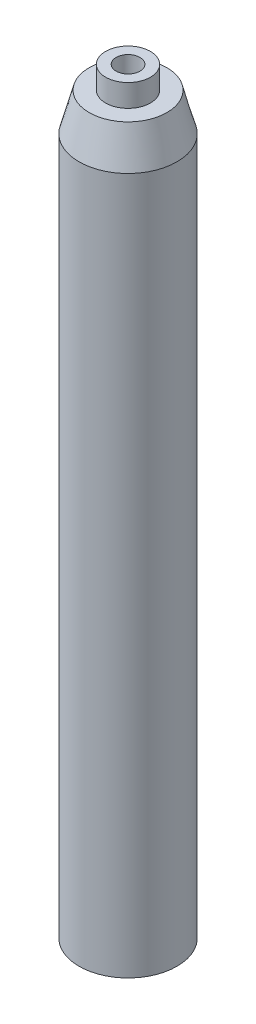
ISO-10303-21;
HEADER;
FILE_DESCRIPTION(('STEP AP214'),'2;1');
FILE_NAME('part.step','',(''),(''),'','','');
FILE_SCHEMA(('AUTOMOTIVE_DESIGN { 1 0 10303 214 1 1 1 1 }'));
ENDSEC;
DATA;
#1=APPLICATION_CONTEXT('core data for automotive mechanical design processes');
#2=APPLICATION_PROTOCOL_DEFINITION('international standard','automotive_design',2000,#1);
#3=PRODUCT_CONTEXT('',#1,'mechanical');
#4=PRODUCT('Part','Part','',(#3));
#5=PRODUCT_RELATED_PRODUCT_CATEGORY('part','',(#4));
#6=PRODUCT_DEFINITION_FORMATION('','',#4);
#7=PRODUCT_DEFINITION_CONTEXT('part definition',#1,'design');
#8=PRODUCT_DEFINITION('design','',#6,#7);
#9=PRODUCT_DEFINITION_SHAPE('','',#8);
#10=(LENGTH_UNIT() NAMED_UNIT(*) SI_UNIT(.MILLI.,.METRE.));
#11=(NAMED_UNIT(*) PLANE_ANGLE_UNIT() SI_UNIT($,.RADIAN.));
#12=(NAMED_UNIT(*) SI_UNIT($,.STERADIAN.) SOLID_ANGLE_UNIT());
#13=UNCERTAINTY_MEASURE_WITH_UNIT(LENGTH_MEASURE(1.E-05),#10,'distance_accuracy_value','');
#14=(GEOMETRIC_REPRESENTATION_CONTEXT(3) GLOBAL_UNCERTAINTY_ASSIGNED_CONTEXT((#13)) GLOBAL_UNIT_ASSIGNED_CONTEXT((#10,
#11,#12)) REPRESENTATION_CONTEXT('',''));
#15=CARTESIAN_POINT('',(0.,0.,0.));
#16=DIRECTION('',(0.,0.,1.));
#17=DIRECTION('',(1.,0.,0.));
#18=AXIS2_PLACEMENT_3D('',#15,#16,#17);
#19=CARTESIAN_POINT('',(0.,85.852,0.));
#20=DIRECTION('',(0.,-1.,0.));
#21=DIRECTION('',(1.,0.,0.));
#22=AXIS2_PLACEMENT_3D('',#19,#20,#21);
#23=CYLINDRICAL_SURFACE('',#22,1.35255);
#24=CARTESIAN_POINT('',(0.,70.77456,0.));
#25=DIRECTION('',(0.,-1.,0.));
#26=DIRECTION('',(1.,0.,0.));
#27=AXIS2_PLACEMENT_3D('',#24,#25,#26);
#28=CIRCLE('',#27,1.35255);
#29=CARTESIAN_POINT('',(1.35255,70.77456,0.));
#30=VERTEX_POINT('',#29);
#31=EDGE_CURVE('E11',#30,#30,#28,.T.);
#32=ORIENTED_EDGE('',*,*,#31,.T.);
#33=EDGE_LOOP('',(#32));
#34=FACE_BOUND('',#33,.T.);
#35=CARTESIAN_POINT('',(0.,85.852,0.));
#36=DIRECTION('',(0.,-1.,0.));
#37=DIRECTION('',(1.,0.,0.));
#38=AXIS2_PLACEMENT_3D('',#35,#36,#37);
#39=CIRCLE('',#38,1.35255);
#40=CARTESIAN_POINT('',(1.35255000000008,85.852,0.));
#41=VERTEX_POINT('',#40);
#42=EDGE_CURVE('E60',#41,#41,#39,.T.);
#43=ORIENTED_EDGE('',*,*,#42,.F.);
#44=EDGE_LOOP('',(#43));
#45=FACE_BOUND('',#44,.T.);
#46=ADVANCED_FACE('F37',(#34,#45),#23,.F.);
#47=CARTESIAN_POINT('',(0.,70.77456,0.));
#48=DIRECTION('',(0.,1.,0.));
#49=DIRECTION('',(-1.,0.,0.));
#50=AXIS2_PLACEMENT_3D('',#47,#48,#49);
#51=CONICAL_SURFACE('',#50,1.35255,1.02974425816915);
#52=CARTESIAN_POINT('',(0.,69.9618659688,0.));
#53=VERTEX_POINT('',#52);
#54=VERTEX_LOOP('',#53);
#55=FACE_BOUND('',#54,.T.);
#56=ORIENTED_EDGE('',*,*,#31,.F.);
#57=EDGE_LOOP('',(#56));
#58=FACE_BOUND('',#57,.T.);
#59=ADVANCED_FACE('F50',(#55,#58),#51,.F.);
#60=CARTESIAN_POINT('',(-2.77348350858344E-13,15.9002940312002,0.));
#61=DIRECTION('',(0.,-1.,0.));
#62=DIRECTION('',(1.,0.,0.));
#63=AXIS2_PLACEMENT_3D('',#60,#61,#62);
#64=CONICAL_SURFACE('',#63,0.,1.02974425816914);
#65=CARTESIAN_POINT('',(-2.81517658949606E-13,15.0876,0.));
#66=DIRECTION('',(0.,-1.,0.));
#67=DIRECTION('',(1.,0.,0.));
#68=AXIS2_PLACEMENT_3D('',#65,#66,#67);
#69=CIRCLE('',#68,1.35255000000028);
#70=CARTESIAN_POINT('',(1.35255,15.0876,0.));
#71=VERTEX_POINT('',#70);
#72=EDGE_CURVE('E44',#71,#71,#69,.T.);
#73=ORIENTED_EDGE('',*,*,#72,.T.);
#74=EDGE_LOOP('',(#73));
#75=FACE_BOUND('',#74,.T.);
#76=CARTESIAN_POINT('',(-2.78315433070307E-13,15.9002940312002,0.));
#77=VERTEX_POINT('',#76);
#78=VERTEX_LOOP('',#77);
#79=FACE_BOUND('',#78,.T.);
#80=ADVANCED_FACE('F53',(#75,#79),#64,.F.);
#81=CARTESIAN_POINT('',(0.,85.852,0.));
#82=DIRECTION('',(0.,-1.,0.));
#83=DIRECTION('',(1.,0.,0.));
#84=AXIS2_PLACEMENT_3D('',#81,#82,#83);
#85=CYLINDRICAL_SURFACE('',#84,1.35255000000032);
#86=CARTESIAN_POINT('',(-3.58920531793191E-13,0.,0.));
#87=DIRECTION('',(0.,-1.,0.));
#88=DIRECTION('',(1.,0.,0.));
#89=AXIS2_PLACEMENT_3D('',#86,#87,#88);
#90=CIRCLE('',#89,1.35255000000036);
#91=CARTESIAN_POINT('',(1.35255,0.,0.));
#92=VERTEX_POINT('',#91);
#93=EDGE_CURVE('E79',#92,#92,#90,.T.);
#94=ORIENTED_EDGE('',*,*,#93,.T.);
#95=EDGE_LOOP('',(#94));
#96=FACE_BOUND('',#95,.T.);
#97=ORIENTED_EDGE('',*,*,#72,.F.);
#98=EDGE_LOOP('',(#97));
#99=FACE_BOUND('',#98,.T.);
#100=ADVANCED_FACE('F85',(#96,#99),#85,.F.);
#101=CARTESIAN_POINT('',(1.35255,0.,0.));
#102=DIRECTION('',(0.,-1.,0.));
#103=DIRECTION('',(1.,0.,0.));
#104=AXIS2_PLACEMENT_3D('',#101,#102,#103);
#105=PLANE('',#104);
#106=CARTESIAN_POINT('',(-3.58920531793191E-13,0.,0.));
#107=DIRECTION('',(0.,-1.,0.));
#108=DIRECTION('',(1.,0.,0.));
#109=AXIS2_PLACEMENT_3D('',#106,#107,#108);
#110=CIRCLE('',#109,5.55625000216313);
#111=CARTESIAN_POINT('',(5.55625000216277,0.,0.));
#112=VERTEX_POINT('',#111);
#113=EDGE_CURVE('E76',#112,#112,#110,.T.);
#114=ORIENTED_EDGE('',*,*,#113,.T.);
#115=EDGE_LOOP('',(#114));
#116=FACE_BOUND('',#115,.T.);
#117=ORIENTED_EDGE('',*,*,#93,.F.);
#118=EDGE_LOOP('',(#117));
#119=FACE_BOUND('',#118,.T.);
#120=ADVANCED_FACE('F87',(#116,#119),#105,.T.);
#121=CARTESIAN_POINT('',(0.,85.852,0.));
#122=DIRECTION('',(0.,-1.,0.));
#123=DIRECTION('',(1.,0.,0.));
#124=AXIS2_PLACEMENT_3D('',#121,#122,#123);
#125=CYLINDRICAL_SURFACE('',#124,5.55625000216293);
#126=CARTESIAN_POINT('',(0.,79.0462659275284,0.));
#127=DIRECTION('',(0.,-1.,0.));
#128=DIRECTION('',(1.,0.,0.));
#129=AXIS2_PLACEMENT_3D('',#126,#127,#128);
#130=CIRCLE('',#129,5.55625000216273);
#131=CARTESIAN_POINT('',(5.55625000216278,79.0462659275284,0.));
#132=VERTEX_POINT('',#131);
#133=EDGE_CURVE('E73',#132,#132,#130,.T.);
#134=ORIENTED_EDGE('',*,*,#133,.T.);
#135=EDGE_LOOP('',(#134));
#136=FACE_BOUND('',#135,.T.);
#137=ORIENTED_EDGE('',*,*,#113,.F.);
#138=EDGE_LOOP('',(#137));
#139=FACE_BOUND('',#138,.T.);
#140=ADVANCED_FACE('F94',(#136,#139),#125,.T.);
#141=CARTESIAN_POINT('',(0.,79.0462659275284,0.));
#142=DIRECTION('',(0.,-1.,0.));
#143=DIRECTION('',(1.,0.,0.));
#144=AXIS2_PLACEMENT_3D('',#141,#142,#143);
#145=CONICAL_SURFACE('',#144,5.55625000216273,0.261799388306172);
#146=CARTESIAN_POINT('',(0.,83.3120000000001,0.));
#147=DIRECTION('',(0.,-1.,0.));
#148=DIRECTION('',(1.,0.,0.));
#149=AXIS2_PLACEMENT_3D('',#146,#147,#148);
#150=CIRCLE('',#149,4.41324999999992);
#151=CARTESIAN_POINT('',(4.41324999999999,83.3120000000001,0.));
#152=VERTEX_POINT('',#151);
#153=EDGE_CURVE('E70',#152,#152,#150,.T.);
#154=ORIENTED_EDGE('',*,*,#153,.T.);
#155=EDGE_LOOP('',(#154));
#156=FACE_BOUND('',#155,.T.);
#157=ORIENTED_EDGE('',*,*,#133,.F.);
#158=EDGE_LOOP('',(#157));
#159=FACE_BOUND('',#158,.T.);
#160=ADVANCED_FACE('F101',(#156,#159),#145,.T.);
#161=CARTESIAN_POINT('',(4.41324999999999,83.312,0.));
#162=DIRECTION('',(0.,1.,0.));
#163=DIRECTION('',(-1.,0.,0.));
#164=AXIS2_PLACEMENT_3D('',#161,#162,#163);
#165=PLANE('',#164);
#166=CARTESIAN_POINT('',(0.,83.312,0.));
#167=DIRECTION('',(0.,-1.,0.));
#168=DIRECTION('',(1.,0.,0.));
#169=AXIS2_PLACEMENT_3D('',#166,#167,#168);
#170=CIRCLE('',#169,2.53999999999993);
#171=CARTESIAN_POINT('',(2.54,83.312,0.));
#172=VERTEX_POINT('',#171);
#173=EDGE_CURVE('E65',#172,#172,#170,.T.);
#174=ORIENTED_EDGE('',*,*,#173,.T.);
#175=EDGE_LOOP('',(#174));
#176=FACE_BOUND('',#175,.T.);
#177=ORIENTED_EDGE('',*,*,#153,.F.);
#178=EDGE_LOOP('',(#177));
#179=FACE_BOUND('',#178,.T.);
#180=ADVANCED_FACE('F105',(#176,#179),#165,.T.);
#181=CARTESIAN_POINT('',(0.,85.852,0.));
#182=DIRECTION('',(0.,-1.,0.));
#183=DIRECTION('',(1.,0.,0.));
#184=AXIS2_PLACEMENT_3D('',#181,#182,#183);
#185=CYLINDRICAL_SURFACE('',#184,2.53999999999993);
#186=CARTESIAN_POINT('',(0.,85.852,0.));
#187=DIRECTION('',(0.,-1.,0.));
#188=DIRECTION('',(1.,0.,0.));
#189=AXIS2_PLACEMENT_3D('',#186,#187,#188);
#190=CIRCLE('',#189,2.53999999999992);
#191=CARTESIAN_POINT('',(2.54,85.852,0.));
#192=VERTEX_POINT('',#191);
#193=EDGE_CURVE('E62',#192,#192,#190,.T.);
#194=ORIENTED_EDGE('',*,*,#193,.T.);
#195=EDGE_LOOP('',(#194));
#196=FACE_BOUND('',#195,.T.);
#197=ORIENTED_EDGE('',*,*,#173,.F.);
#198=EDGE_LOOP('',(#197));
#199=FACE_BOUND('',#198,.T.);
#200=ADVANCED_FACE('F109',(#196,#199),#185,.T.);
#201=CARTESIAN_POINT('',(2.54,85.852,0.));
#202=DIRECTION('',(0.,1.,0.));
#203=DIRECTION('',(-1.,0.,0.));
#204=AXIS2_PLACEMENT_3D('',#201,#202,#203);
#205=PLANE('',#204);
#206=ORIENTED_EDGE('',*,*,#42,.T.);
#207=EDGE_LOOP('',(#206));
#208=FACE_BOUND('',#207,.T.);
#209=ORIENTED_EDGE('',*,*,#193,.F.);
#210=EDGE_LOOP('',(#209));
#211=FACE_BOUND('',#210,.T.);
#212=ADVANCED_FACE('F113',(#208,#211),#205,.T.);
#213=CLOSED_SHELL('',(#46,#59,#80,#100,#120,#140,#160,#180,#200,#212));
#214=MANIFOLD_SOLID_BREP('B2',#213);
#215=ADVANCED_BREP_SHAPE_REPRESENTATION('',(#18,#214),#14);
#216=SHAPE_DEFINITION_REPRESENTATION(#9,#215);
ENDSEC;
END-ISO-10303-21;
